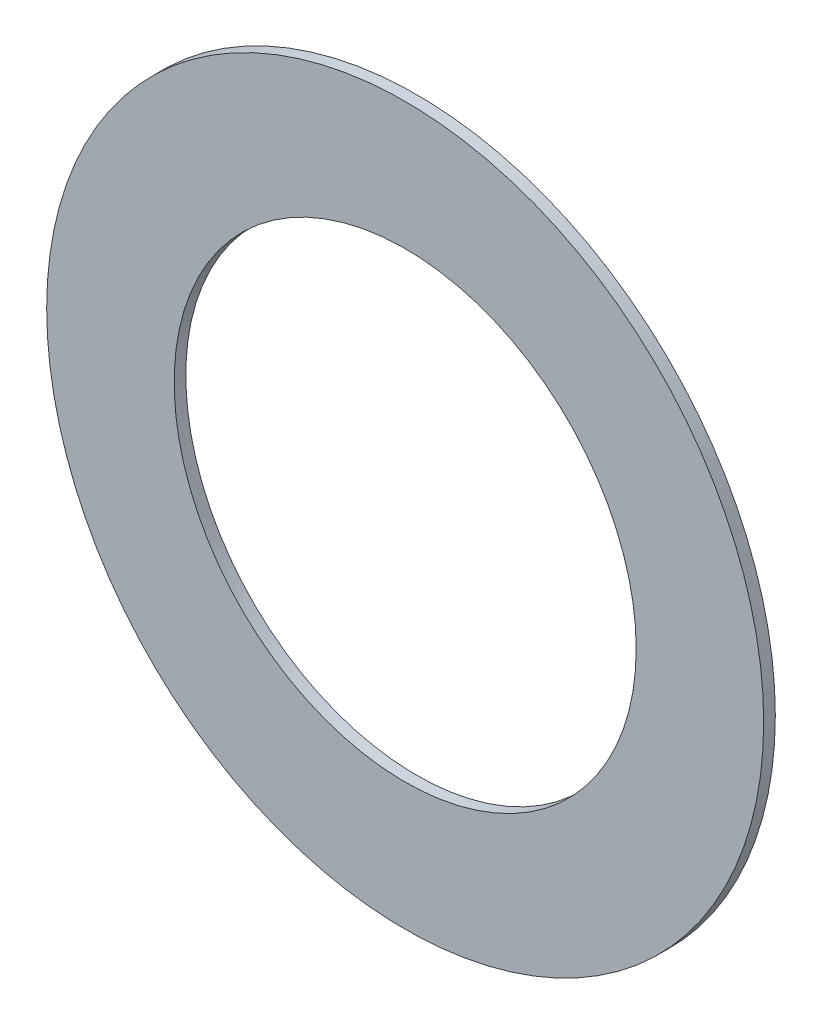
ISO-10303-21;
HEADER;
FILE_DESCRIPTION(('STEP AP214'),'2;1');
FILE_NAME('part.step','',(''),(''),'','','');
FILE_SCHEMA(('AUTOMOTIVE_DESIGN { 1 0 10303 214 1 1 1 1 }'));
ENDSEC;
DATA;
#1=APPLICATION_CONTEXT('core data for automotive mechanical design processes');
#2=APPLICATION_PROTOCOL_DEFINITION('international standard','automotive_design',2000,#1);
#3=PRODUCT_CONTEXT('',#1,'mechanical');
#4=PRODUCT('Part','Part','',(#3));
#5=PRODUCT_RELATED_PRODUCT_CATEGORY('part','',(#4));
#6=PRODUCT_DEFINITION_FORMATION('','',#4);
#7=PRODUCT_DEFINITION_CONTEXT('part definition',#1,'design');
#8=PRODUCT_DEFINITION('design','',#6,#7);
#9=PRODUCT_DEFINITION_SHAPE('','',#8);
#10=(LENGTH_UNIT() NAMED_UNIT(*) SI_UNIT(.MILLI.,.METRE.));
#11=(NAMED_UNIT(*) PLANE_ANGLE_UNIT() SI_UNIT($,.RADIAN.));
#12=(NAMED_UNIT(*) SI_UNIT($,.STERADIAN.) SOLID_ANGLE_UNIT());
#13=UNCERTAINTY_MEASURE_WITH_UNIT(LENGTH_MEASURE(1.E-05),#10,'distance_accuracy_value','');
#14=(GEOMETRIC_REPRESENTATION_CONTEXT(3) GLOBAL_UNCERTAINTY_ASSIGNED_CONTEXT((#13)) GLOBAL_UNIT_ASSIGNED_CONTEXT((#10,
#11,#12)) REPRESENTATION_CONTEXT('',''));
#15=CARTESIAN_POINT('',(0.,0.,0.));
#16=DIRECTION('',(0.,0.,1.));
#17=DIRECTION('',(1.,0.,0.));
#18=AXIS2_PLACEMENT_3D('',#15,#16,#17);
#19=CARTESIAN_POINT('',(0.,0.,0.2286));
#20=DIRECTION('',(0.,0.,1.));
#21=DIRECTION('',(1.,0.,0.));
#22=AXIS2_PLACEMENT_3D('',#19,#20,#21);
#23=PLANE('',#22);
#24=CARTESIAN_POINT('',(0.,0.,0.2286));
#25=DIRECTION('',(0.,0.,1.));
#26=DIRECTION('',(1.,0.,0.));
#27=AXIS2_PLACEMENT_3D('',#24,#25,#26);
#28=CIRCLE('',#27,7.0358);
#29=CARTESIAN_POINT('',(7.0358,0.,0.2286));
#30=VERTEX_POINT('',#29);
#31=EDGE_CURVE('E10',#30,#30,#28,.T.);
#32=ORIENTED_EDGE('',*,*,#31,.T.);
#33=EDGE_LOOP('',(#32));
#34=FACE_BOUND('',#33,.T.);
#35=CARTESIAN_POINT('',(0.,0.,0.2286));
#36=DIRECTION('',(0.,0.,1.));
#37=DIRECTION('',(1.,0.,0.));
#38=AXIS2_PLACEMENT_3D('',#35,#36,#37);
#39=CIRCLE('',#38,4.5339);
#40=CARTESIAN_POINT('',(4.5339,0.,0.2286));
#41=VERTEX_POINT('',#40);
#42=EDGE_CURVE('E42',#41,#41,#39,.T.);
#43=ORIENTED_EDGE('',*,*,#42,.F.);
#44=EDGE_LOOP('',(#43));
#45=FACE_BOUND('',#44,.T.);
#46=ADVANCED_FACE('F31',(#34,#45),#23,.T.);
#47=CARTESIAN_POINT('',(0.,0.,0.));
#48=DIRECTION('',(0.,0.,1.));
#49=DIRECTION('',(1.,0.,0.));
#50=AXIS2_PLACEMENT_3D('',#47,#48,#49);
#51=PLANE('',#50);
#52=CARTESIAN_POINT('',(0.,0.,0.));
#53=DIRECTION('',(0.,0.,1.));
#54=DIRECTION('',(1.,0.,0.));
#55=AXIS2_PLACEMENT_3D('',#52,#53,#54);
#56=CIRCLE('',#55,7.0358);
#57=CARTESIAN_POINT('',(7.0358,0.,0.));
#58=VERTEX_POINT('',#57);
#59=EDGE_CURVE('E35',#58,#58,#56,.T.);
#60=ORIENTED_EDGE('',*,*,#59,.F.);
#61=EDGE_LOOP('',(#60));
#62=FACE_BOUND('',#61,.T.);
#63=CARTESIAN_POINT('',(0.,0.,0.));
#64=DIRECTION('',(0.,0.,1.));
#65=DIRECTION('',(1.,0.,0.));
#66=AXIS2_PLACEMENT_3D('',#63,#64,#65);
#67=CIRCLE('',#66,4.5339);
#68=CARTESIAN_POINT('',(4.5339,0.,0.));
#69=VERTEX_POINT('',#68);
#70=EDGE_CURVE('E44',#69,#69,#67,.T.);
#71=ORIENTED_EDGE('',*,*,#70,.T.);
#72=EDGE_LOOP('',(#71));
#73=FACE_BOUND('',#72,.T.);
#74=ADVANCED_FACE('F54',(#62,#73),#51,.F.);
#75=CARTESIAN_POINT('',(0.,0.,0.2286));
#76=DIRECTION('',(0.,0.,-1.));
#77=DIRECTION('',(-1.,0.,0.));
#78=AXIS2_PLACEMENT_3D('',#75,#76,#77);
#79=CYLINDRICAL_SURFACE('',#78,7.0358);
#80=ORIENTED_EDGE('',*,*,#31,.F.);
#81=EDGE_LOOP('',(#80));
#82=FACE_BOUND('',#81,.T.);
#83=ORIENTED_EDGE('',*,*,#59,.T.);
#84=EDGE_LOOP('',(#83));
#85=FACE_BOUND('',#84,.T.);
#86=ADVANCED_FACE('F33',(#82,#85),#79,.T.);
#87=CARTESIAN_POINT('',(0.,0.,0.2286));
#88=DIRECTION('',(0.,0.,-1.));
#89=DIRECTION('',(-1.,0.,0.));
#90=AXIS2_PLACEMENT_3D('',#87,#88,#89);
#91=CYLINDRICAL_SURFACE('',#90,4.5339);
#92=ORIENTED_EDGE('',*,*,#42,.T.);
#93=EDGE_LOOP('',(#92));
#94=FACE_BOUND('',#93,.T.);
#95=ORIENTED_EDGE('',*,*,#70,.F.);
#96=EDGE_LOOP('',(#95));
#97=FACE_BOUND('',#96,.T.);
#98=ADVANCED_FACE('F50',(#94,#97),#91,.F.);
#99=CLOSED_SHELL('',(#46,#74,#86,#98));
#100=MANIFOLD_SOLID_BREP('B2',#99);
#101=ADVANCED_BREP_SHAPE_REPRESENTATION('',(#18,#100),#14);
#102=SHAPE_DEFINITION_REPRESENTATION(#9,#101);
ENDSEC;
END-ISO-10303-21;
